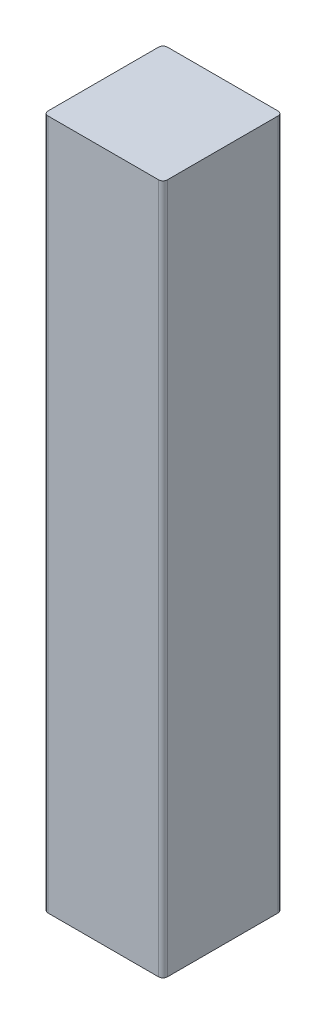
ISO-10303-21;
HEADER;
FILE_DESCRIPTION(('STEP AP214'),'2;1');
FILE_NAME('part.step','',(''),(''),'','','');
FILE_SCHEMA(('AUTOMOTIVE_DESIGN { 1 0 10303 214 1 1 1 1 }'));
ENDSEC;
DATA;
#1=APPLICATION_CONTEXT('core data for automotive mechanical design processes');
#2=APPLICATION_PROTOCOL_DEFINITION('international standard','automotive_design',2000,#1);
#3=PRODUCT_CONTEXT('',#1,'mechanical');
#4=PRODUCT('Part','Part','',(#3));
#5=PRODUCT_RELATED_PRODUCT_CATEGORY('part','',(#4));
#6=PRODUCT_DEFINITION_FORMATION('','',#4);
#7=PRODUCT_DEFINITION_CONTEXT('part definition',#1,'design');
#8=PRODUCT_DEFINITION('design','',#6,#7);
#9=PRODUCT_DEFINITION_SHAPE('','',#8);
#10=(LENGTH_UNIT() NAMED_UNIT(*) SI_UNIT(.MILLI.,.METRE.));
#11=(NAMED_UNIT(*) PLANE_ANGLE_UNIT() SI_UNIT($,.RADIAN.));
#12=(NAMED_UNIT(*) SI_UNIT($,.STERADIAN.) SOLID_ANGLE_UNIT());
#13=UNCERTAINTY_MEASURE_WITH_UNIT(LENGTH_MEASURE(1.E-05),#10,'distance_accuracy_value','');
#14=(GEOMETRIC_REPRESENTATION_CONTEXT(3) GLOBAL_UNCERTAINTY_ASSIGNED_CONTEXT((#13)) GLOBAL_UNIT_ASSIGNED_CONTEXT((#10,
#11,#12)) REPRESENTATION_CONTEXT('',''));
#15=CARTESIAN_POINT('',(0.,0.,0.));
#16=DIRECTION('',(0.,0.,1.));
#17=DIRECTION('',(1.,0.,0.));
#18=AXIS2_PLACEMENT_3D('',#15,#16,#17);
#19=CARTESIAN_POINT('',(44.45,0.,-88.9000000000001));
#20=DIRECTION('',(0.,1.,0.));
#21=DIRECTION('',(0.,0.,1.));
#22=AXIS2_PLACEMENT_3D('',#19,#20,#21);
#23=PLANE('',#22);
#24=DIRECTION('',(0.,0.,-1.));
#25=VECTOR('',#24,1.);
#26=CARTESIAN_POINT('',(-44.45,0.,-88.9000000000001));
#27=LINE('',#26,#25);
#28=CARTESIAN_POINT('',(-44.45,0.,-3.17500000000003));
#29=VERTEX_POINT('',#28);
#30=CARTESIAN_POINT('',(-44.45,0.,-85.7250000000001));
#31=VERTEX_POINT('',#30);
#32=EDGE_CURVE('E169',#29,#31,#27,.T.);
#33=ORIENTED_EDGE('',*,*,#32,.T.);
#34=CARTESIAN_POINT('',(-41.275,0.,-85.7250000000001));
#35=DIRECTION('',(0.,1.,0.));
#36=DIRECTION('',(0.,0.,1.));
#37=AXIS2_PLACEMENT_3D('',#34,#35,#36);
#38=CIRCLE('',#37,3.175);
#39=CARTESIAN_POINT('',(-41.275,0.,-88.9000000000001));
#40=VERTEX_POINT('',#39);
#41=EDGE_CURVE('E143',#31,#40,#38,.F.);
#42=ORIENTED_EDGE('',*,*,#41,.T.);
#43=DIRECTION('',(-1.,0.,0.));
#44=VECTOR('',#43,1.);
#45=CARTESIAN_POINT('',(44.45,0.,-88.9000000000001));
#46=LINE('',#45,#44);
#47=CARTESIAN_POINT('',(41.275,0.,-88.9000000000001));
#48=VERTEX_POINT('',#47);
#49=EDGE_CURVE('E122',#48,#40,#46,.T.);
#50=ORIENTED_EDGE('',*,*,#49,.F.);
#51=CARTESIAN_POINT('',(41.275,0.,-85.7250000000001));
#52=DIRECTION('',(0.,1.,0.));
#53=DIRECTION('',(0.,0.,1.));
#54=AXIS2_PLACEMENT_3D('',#51,#52,#53);
#55=CIRCLE('',#54,3.175);
#56=CARTESIAN_POINT('',(44.45,0.,-85.7250000000001));
#57=VERTEX_POINT('',#56);
#58=EDGE_CURVE('E127',#48,#57,#55,.F.);
#59=ORIENTED_EDGE('',*,*,#58,.T.);
#60=DIRECTION('',(0.,0.,-1.));
#61=VECTOR('',#60,1.);
#62=CARTESIAN_POINT('',(44.45,0.,-88.9000000000001));
#63=LINE('',#62,#61);
#64=CARTESIAN_POINT('',(44.45,0.,-3.17500000000003));
#65=VERTEX_POINT('',#64);
#66=EDGE_CURVE('E164',#65,#57,#63,.T.);
#67=ORIENTED_EDGE('',*,*,#66,.F.);
#68=CARTESIAN_POINT('',(41.275,0.,-3.175));
#69=DIRECTION('',(0.,1.,0.));
#70=DIRECTION('',(0.,0.,1.));
#71=AXIS2_PLACEMENT_3D('',#68,#69,#70);
#72=CIRCLE('',#71,3.175);
#73=CARTESIAN_POINT('',(41.275,0.,0.));
#74=VERTEX_POINT('',#73);
#75=EDGE_CURVE('E57',#65,#74,#72,.F.);
#76=ORIENTED_EDGE('',*,*,#75,.T.);
#77=DIRECTION('',(-1.,0.,0.));
#78=VECTOR('',#77,1.);
#79=CARTESIAN_POINT('',(44.45,0.,0.));
#80=LINE('',#79,#78);
#81=CARTESIAN_POINT('',(-41.275,0.,0.));
#82=VERTEX_POINT('',#81);
#83=EDGE_CURVE('E154',#74,#82,#80,.T.);
#84=ORIENTED_EDGE('',*,*,#83,.T.);
#85=CARTESIAN_POINT('',(-41.275,0.,-3.175));
#86=DIRECTION('',(0.,1.,0.));
#87=DIRECTION('',(0.,0.,1.));
#88=AXIS2_PLACEMENT_3D('',#85,#86,#87);
#89=CIRCLE('',#88,3.175);
#90=EDGE_CURVE('E50',#82,#29,#89,.F.);
#91=ORIENTED_EDGE('',*,*,#90,.T.);
#92=EDGE_LOOP('',(#33,#42,#50,#59,#67,#76,#84,#91));
#93=FACE_BOUND('',#92,.T.);
#94=ADVANCED_FACE('F35',(#93),#23,.F.);
#95=CARTESIAN_POINT('',(44.45,514.35,-88.9));
#96=DIRECTION('',(0.,0.,1.));
#97=DIRECTION('',(0.,-1.,0.));
#98=AXIS2_PLACEMENT_3D('',#95,#96,#97);
#99=PLANE('',#98);
#100=ORIENTED_EDGE('',*,*,#49,.T.);
#101=DIRECTION('',(0.,1.,0.));
#102=VECTOR('',#101,1.);
#103=CARTESIAN_POINT('',(-41.275,514.35,-88.9));
#104=LINE('',#103,#102);
#105=CARTESIAN_POINT('',(-41.275,514.35,-88.9));
#106=VERTEX_POINT('',#105);
#107=EDGE_CURVE('E121',#40,#106,#104,.T.);
#108=ORIENTED_EDGE('',*,*,#107,.T.);
#109=DIRECTION('',(-1.,0.,0.));
#110=VECTOR('',#109,1.);
#111=CARTESIAN_POINT('',(44.45,514.35,-88.9));
#112=LINE('',#111,#110);
#113=CARTESIAN_POINT('',(41.275,514.35,-88.9));
#114=VERTEX_POINT('',#113);
#115=EDGE_CURVE('E104',#114,#106,#112,.T.);
#116=ORIENTED_EDGE('',*,*,#115,.F.);
#117=DIRECTION('',(0.,1.,0.));
#118=VECTOR('',#117,1.);
#119=CARTESIAN_POINT('',(41.275,514.35,-88.9));
#120=LINE('',#119,#118);
#121=EDGE_CURVE('E118',#114,#48,#120,.F.);
#122=ORIENTED_EDGE('',*,*,#121,.T.);
#123=EDGE_LOOP('',(#100,#108,#116,#122));
#124=FACE_BOUND('',#123,.T.);
#125=ADVANCED_FACE('F117',(#124),#99,.F.);
#126=CARTESIAN_POINT('',(44.45,514.35,0.));
#127=DIRECTION('',(0.,-1.,0.));
#128=DIRECTION('',(0.,0.,-1.));
#129=AXIS2_PLACEMENT_3D('',#126,#127,#128);
#130=PLANE('',#129);
#131=ORIENTED_EDGE('',*,*,#115,.T.);
#132=CARTESIAN_POINT('',(-41.275,514.35,-85.725));
#133=DIRECTION('',(0.,-1.,0.));
#134=DIRECTION('',(0.,0.,-1.));
#135=AXIS2_PLACEMENT_3D('',#132,#133,#134);
#136=CIRCLE('',#135,3.175);
#137=CARTESIAN_POINT('',(-44.45,514.35,-85.725));
#138=VERTEX_POINT('',#137);
#139=EDGE_CURVE('E111',#106,#138,#136,.F.);
#140=ORIENTED_EDGE('',*,*,#139,.T.);
#141=DIRECTION('',(0.,0.,1.));
#142=VECTOR('',#141,1.);
#143=CARTESIAN_POINT('',(-44.45,514.35,0.));
#144=LINE('',#143,#142);
#145=CARTESIAN_POINT('',(-44.45,514.35,-3.175));
#146=VERTEX_POINT('',#145);
#147=EDGE_CURVE('E166',#138,#146,#144,.T.);
#148=ORIENTED_EDGE('',*,*,#147,.T.);
#149=CARTESIAN_POINT('',(-41.275,514.35,-3.175));
#150=DIRECTION('',(0.,-1.,0.));
#151=DIRECTION('',(0.,0.,-1.));
#152=AXIS2_PLACEMENT_3D('',#149,#150,#151);
#153=CIRCLE('',#152,3.175);
#154=CARTESIAN_POINT('',(-41.275,514.35,0.));
#155=VERTEX_POINT('',#154);
#156=EDGE_CURVE('E112',#146,#155,#153,.F.);
#157=ORIENTED_EDGE('',*,*,#156,.T.);
#158=DIRECTION('',(-1.,0.,0.));
#159=VECTOR('',#158,1.);
#160=CARTESIAN_POINT('',(44.45,514.35,0.));
#161=LINE('',#160,#159);
#162=CARTESIAN_POINT('',(41.275,514.35,0.));
#163=VERTEX_POINT('',#162);
#164=EDGE_CURVE('E123',#163,#155,#161,.T.);
#165=ORIENTED_EDGE('',*,*,#164,.F.);
#166=CARTESIAN_POINT('',(41.275,514.35,-3.175));
#167=DIRECTION('',(0.,-1.,0.));
#168=DIRECTION('',(0.,0.,-1.));
#169=AXIS2_PLACEMENT_3D('',#166,#167,#168);
#170=CIRCLE('',#169,3.175);
#171=CARTESIAN_POINT('',(44.45,514.35,-3.175));
#172=VERTEX_POINT('',#171);
#173=EDGE_CURVE('E129',#163,#172,#170,.F.);
#174=ORIENTED_EDGE('',*,*,#173,.T.);
#175=DIRECTION('',(0.,0.,1.));
#176=VECTOR('',#175,1.);
#177=CARTESIAN_POINT('',(44.45,514.35,0.));
#178=LINE('',#177,#176);
#179=CARTESIAN_POINT('',(44.45,514.35,-85.725));
#180=VERTEX_POINT('',#179);
#181=EDGE_CURVE('E106',#180,#172,#178,.T.);
#182=ORIENTED_EDGE('',*,*,#181,.F.);
#183=CARTESIAN_POINT('',(41.275,514.35,-85.725));
#184=DIRECTION('',(0.,-1.,0.));
#185=DIRECTION('',(0.,0.,-1.));
#186=AXIS2_PLACEMENT_3D('',#183,#184,#185);
#187=CIRCLE('',#186,3.175);
#188=EDGE_CURVE('E101',#180,#114,#187,.F.);
#189=ORIENTED_EDGE('',*,*,#188,.T.);
#190=EDGE_LOOP('',(#131,#140,#148,#157,#165,#174,#182,#189));
#191=FACE_BOUND('',#190,.T.);
#192=ADVANCED_FACE('F103',(#191),#130,.F.);
#193=CARTESIAN_POINT('',(44.45,0.,0.));
#194=DIRECTION('',(0.,0.,-1.));
#195=DIRECTION('',(-1.,0.,0.));
#196=AXIS2_PLACEMENT_3D('',#193,#194,#195);
#197=PLANE('',#196);
#198=ORIENTED_EDGE('',*,*,#164,.T.);
#199=DIRECTION('',(0.,-1.,0.));
#200=VECTOR('',#199,1.);
#201=CARTESIAN_POINT('',(-41.275,0.,0.));
#202=LINE('',#201,#200);
#203=EDGE_CURVE('E11',#155,#82,#202,.T.);
#204=ORIENTED_EDGE('',*,*,#203,.T.);
#205=ORIENTED_EDGE('',*,*,#83,.F.);
#206=DIRECTION('',(0.,-1.,0.));
#207=VECTOR('',#206,1.);
#208=CARTESIAN_POINT('',(41.275,0.,0.));
#209=LINE('',#208,#207);
#210=EDGE_CURVE('E43',#74,#163,#209,.F.);
#211=ORIENTED_EDGE('',*,*,#210,.T.);
#212=EDGE_LOOP('',(#198,#204,#205,#211));
#213=FACE_BOUND('',#212,.T.);
#214=ADVANCED_FACE('F153',(#213),#197,.F.);
#215=CARTESIAN_POINT('',(44.45,0.,0.));
#216=DIRECTION('',(-1.,0.,0.));
#217=DIRECTION('',(0.,0.,1.));
#218=AXIS2_PLACEMENT_3D('',#215,#216,#217);
#219=PLANE('',#218);
#220=ORIENTED_EDGE('',*,*,#66,.T.);
#221=DIRECTION('',(0.,1.,0.));
#222=VECTOR('',#221,1.);
#223=CARTESIAN_POINT('',(44.45,0.,-85.7250000000001));
#224=LINE('',#223,#222);
#225=EDGE_CURVE('E148',#57,#180,#224,.T.);
#226=ORIENTED_EDGE('',*,*,#225,.T.);
#227=ORIENTED_EDGE('',*,*,#181,.T.);
#228=DIRECTION('',(0.,-1.,0.));
#229=VECTOR('',#228,1.);
#230=CARTESIAN_POINT('',(44.45,0.,-3.175));
#231=LINE('',#230,#229);
#232=EDGE_CURVE('E145',#172,#65,#231,.T.);
#233=ORIENTED_EDGE('',*,*,#232,.T.);
#234=EDGE_LOOP('',(#220,#226,#227,#233));
#235=FACE_BOUND('',#234,.T.);
#236=ADVANCED_FACE('F163',(#235),#219,.F.);
#237=CARTESIAN_POINT('',(-44.45,0.,0.));
#238=DIRECTION('',(-1.,0.,0.));
#239=DIRECTION('',(0.,0.,1.));
#240=AXIS2_PLACEMENT_3D('',#237,#238,#239);
#241=PLANE('',#240);
#242=ORIENTED_EDGE('',*,*,#147,.F.);
#243=DIRECTION('',(0.,1.,0.));
#244=VECTOR('',#243,1.);
#245=CARTESIAN_POINT('',(-44.45,0.,-85.7250000000001));
#246=LINE('',#245,#244);
#247=EDGE_CURVE('E138',#138,#31,#246,.F.);
#248=ORIENTED_EDGE('',*,*,#247,.T.);
#249=ORIENTED_EDGE('',*,*,#32,.F.);
#250=DIRECTION('',(0.,-1.,0.));
#251=VECTOR('',#250,1.);
#252=CARTESIAN_POINT('',(-44.45,514.35,-3.175));
#253=LINE('',#252,#251);
#254=EDGE_CURVE('E136',#29,#146,#253,.F.);
#255=ORIENTED_EDGE('',*,*,#254,.T.);
#256=EDGE_LOOP('',(#242,#248,#249,#255));
#257=FACE_BOUND('',#256,.T.);
#258=ADVANCED_FACE('F177',(#257),#241,.T.);
#259=CARTESIAN_POINT('',(-41.275,514.35,-85.725));
#260=DIRECTION('',(0.,-1.,0.));
#261=DIRECTION('',(0.,0.,-1.));
#262=AXIS2_PLACEMENT_3D('',#259,#260,#261);
#263=CYLINDRICAL_SURFACE('',#262,3.175);
#264=ORIENTED_EDGE('',*,*,#41,.F.);
#265=ORIENTED_EDGE('',*,*,#247,.F.);
#266=ORIENTED_EDGE('',*,*,#139,.F.);
#267=ORIENTED_EDGE('',*,*,#107,.F.);
#268=EDGE_LOOP('',(#264,#265,#266,#267));
#269=FACE_BOUND('',#268,.T.);
#270=ADVANCED_FACE('F185',(#269),#263,.T.);
#271=CARTESIAN_POINT('',(41.275,0.,-85.7250000000001));
#272=DIRECTION('',(0.,1.,0.));
#273=DIRECTION('',(0.,0.,1.));
#274=AXIS2_PLACEMENT_3D('',#271,#272,#273);
#275=CYLINDRICAL_SURFACE('',#274,3.175);
#276=ORIENTED_EDGE('',*,*,#58,.F.);
#277=ORIENTED_EDGE('',*,*,#121,.F.);
#278=ORIENTED_EDGE('',*,*,#188,.F.);
#279=ORIENTED_EDGE('',*,*,#225,.F.);
#280=EDGE_LOOP('',(#276,#277,#278,#279));
#281=FACE_BOUND('',#280,.T.);
#282=ADVANCED_FACE('F126',(#281),#275,.T.);
#283=CARTESIAN_POINT('',(-41.275,0.,-3.175));
#284=DIRECTION('',(0.,1.,0.));
#285=DIRECTION('',(0.,0.,1.));
#286=AXIS2_PLACEMENT_3D('',#283,#284,#285);
#287=CYLINDRICAL_SURFACE('',#286,3.175);
#288=ORIENTED_EDGE('',*,*,#156,.F.);
#289=ORIENTED_EDGE('',*,*,#254,.F.);
#290=ORIENTED_EDGE('',*,*,#90,.F.);
#291=ORIENTED_EDGE('',*,*,#203,.F.);
#292=EDGE_LOOP('',(#288,#289,#290,#291));
#293=FACE_BOUND('',#292,.T.);
#294=ADVANCED_FACE('F179',(#293),#287,.T.);
#295=CARTESIAN_POINT('',(41.275,0.,-3.175));
#296=DIRECTION('',(0.,-1.,0.));
#297=DIRECTION('',(0.,0.,-1.));
#298=AXIS2_PLACEMENT_3D('',#295,#296,#297);
#299=CYLINDRICAL_SURFACE('',#298,3.175);
#300=ORIENTED_EDGE('',*,*,#173,.F.);
#301=ORIENTED_EDGE('',*,*,#210,.F.);
#302=ORIENTED_EDGE('',*,*,#75,.F.);
#303=ORIENTED_EDGE('',*,*,#232,.F.);
#304=EDGE_LOOP('',(#300,#301,#302,#303));
#305=FACE_BOUND('',#304,.T.);
#306=ADVANCED_FACE('F37',(#305),#299,.T.);
#307=CLOSED_SHELL('',(#94,#125,#192,#214,#236,#258,#270,#282,#294,#306));
#308=MANIFOLD_SOLID_BREP('B2',#307);
#309=ADVANCED_BREP_SHAPE_REPRESENTATION('',(#18,#308),#14);
#310=SHAPE_DEFINITION_REPRESENTATION(#9,#309);
ENDSEC;
END-ISO-10303-21;
